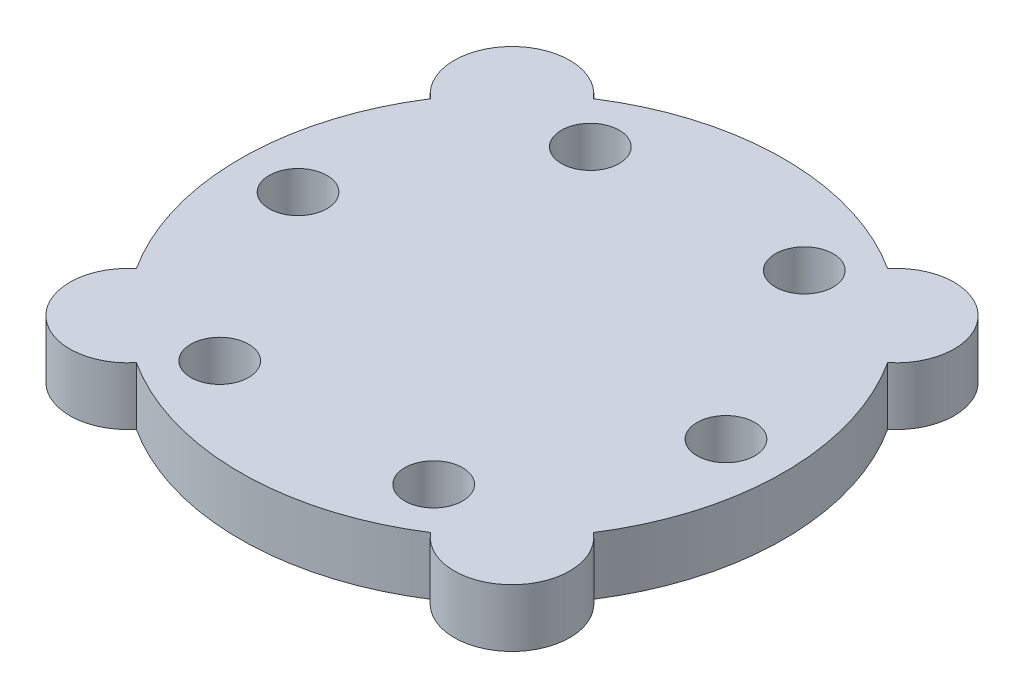
ISO-10303-21;
HEADER;
FILE_DESCRIPTION(('STEP AP214'),'2;1');
FILE_NAME('part.step','',(''),(''),'','','');
FILE_SCHEMA(('AUTOMOTIVE_DESIGN { 1 0 10303 214 1 1 1 1 }'));
ENDSEC;
DATA;
#1=APPLICATION_CONTEXT('core data for automotive mechanical design processes');
#2=APPLICATION_PROTOCOL_DEFINITION('international standard','automotive_design',2000,#1);
#3=PRODUCT_CONTEXT('',#1,'mechanical');
#4=PRODUCT('Part','Part','',(#3));
#5=PRODUCT_RELATED_PRODUCT_CATEGORY('part','',(#4));
#6=PRODUCT_DEFINITION_FORMATION('','',#4);
#7=PRODUCT_DEFINITION_CONTEXT('part definition',#1,'design');
#8=PRODUCT_DEFINITION('design','',#6,#7);
#9=PRODUCT_DEFINITION_SHAPE('','',#8);
#10=(LENGTH_UNIT() NAMED_UNIT(*) SI_UNIT(.MILLI.,.METRE.));
#11=(NAMED_UNIT(*) PLANE_ANGLE_UNIT() SI_UNIT($,.RADIAN.));
#12=(NAMED_UNIT(*) SI_UNIT($,.STERADIAN.) SOLID_ANGLE_UNIT());
#13=UNCERTAINTY_MEASURE_WITH_UNIT(LENGTH_MEASURE(1.E-05),#10,'distance_accuracy_value','');
#14=(GEOMETRIC_REPRESENTATION_CONTEXT(3) GLOBAL_UNCERTAINTY_ASSIGNED_CONTEXT((#13)) GLOBAL_UNIT_ASSIGNED_CONTEXT((#10,
#11,#12)) REPRESENTATION_CONTEXT('',''));
#15=CARTESIAN_POINT('',(0.,0.,0.));
#16=DIRECTION('',(0.,0.,1.));
#17=DIRECTION('',(1.,0.,0.));
#18=AXIS2_PLACEMENT_3D('',#15,#16,#17);
#19=CARTESIAN_POINT('',(0.,0.25,0.));
#20=DIRECTION('',(0.,-1.,0.));
#21=DIRECTION('',(0.,0.,-1.));
#22=AXIS2_PLACEMENT_3D('',#19,#20,#21);
#23=CYLINDRICAL_SURFACE('',#22,2.35);
#24=CARTESIAN_POINT('',(0.,-0.25,0.));
#25=DIRECTION('',(0.,1.,0.));
#26=DIRECTION('',(0.,0.,1.));
#27=AXIS2_PLACEMENT_3D('',#24,#25,#26);
#28=CIRCLE('',#27,2.35);
#29=CARTESIAN_POINT('',(-1.27254181674957,-0.25,1.97563592916906));
#30=VERTEX_POINT('',#29);
#31=CARTESIAN_POINT('',(1.27254181674956,-0.25,1.97563592916907));
#32=VERTEX_POINT('',#31);
#33=EDGE_CURVE('E132',#30,#32,#28,.T.);
#34=ORIENTED_EDGE('',*,*,#33,.T.);
#35=DIRECTION('',(0.,-1.,0.));
#36=VECTOR('',#35,1.);
#37=CARTESIAN_POINT('',(1.27254181674956,0.25,1.97563592916907));
#38=LINE('',#37,#36);
#39=CARTESIAN_POINT('',(1.27254181674956,0.25,1.97563592916907));
#40=VERTEX_POINT('',#39);
#41=EDGE_CURVE('E11',#40,#32,#38,.T.);
#42=ORIENTED_EDGE('',*,*,#41,.F.);
#43=CARTESIAN_POINT('',(0.,0.25,0.));
#44=DIRECTION('',(0.,1.,0.));
#45=DIRECTION('',(0.,0.,1.));
#46=AXIS2_PLACEMENT_3D('',#43,#44,#45);
#47=CIRCLE('',#46,2.35);
#48=CARTESIAN_POINT('',(-1.27254181674957,0.25,1.97563592916906));
#49=VERTEX_POINT('',#48);
#50=EDGE_CURVE('E147',#49,#40,#47,.T.);
#51=ORIENTED_EDGE('',*,*,#50,.F.);
#52=DIRECTION('',(0.,-1.,0.));
#53=VECTOR('',#52,1.);
#54=CARTESIAN_POINT('',(-1.27254181674957,0.25,1.97563592916906));
#55=LINE('',#54,#53);
#56=EDGE_CURVE('E128',#49,#30,#55,.T.);
#57=ORIENTED_EDGE('',*,*,#56,.T.);
#58=EDGE_LOOP('',(#34,#42,#51,#57));
#59=FACE_BOUND('',#58,.T.);
#60=ADVANCED_FACE('F36',(#59),#23,.T.);
#61=CARTESIAN_POINT('',(1.66170093578838,0.25,1.66170093578839));
#62=DIRECTION('',(0.,-1.,0.));
#63=DIRECTION('',(0.,0.,-1.));
#64=AXIS2_PLACEMENT_3D('',#61,#62,#63);
#65=CYLINDRICAL_SURFACE('',#64,0.5);
#66=CARTESIAN_POINT('',(1.66170093578838,-0.25,1.66170093578839));
#67=DIRECTION('',(0.,1.,0.));
#68=DIRECTION('',(0.,0.,1.));
#69=AXIS2_PLACEMENT_3D('',#66,#67,#68);
#70=CIRCLE('',#69,0.5);
#71=CARTESIAN_POINT('',(1.97563592916906,-0.25,1.27254181674957));
#72=VERTEX_POINT('',#71);
#73=EDGE_CURVE('E135',#32,#72,#70,.T.);
#74=ORIENTED_EDGE('',*,*,#73,.T.);
#75=DIRECTION('',(0.,-1.,0.));
#76=VECTOR('',#75,1.);
#77=CARTESIAN_POINT('',(1.97563592916906,0.25,1.27254181674957));
#78=LINE('',#77,#76);
#79=CARTESIAN_POINT('',(1.97563592916906,0.25,1.27254181674957));
#80=VERTEX_POINT('',#79);
#81=EDGE_CURVE('E44',#80,#72,#78,.T.);
#82=ORIENTED_EDGE('',*,*,#81,.F.);
#83=CARTESIAN_POINT('',(1.66170093578838,0.25,1.66170093578839));
#84=DIRECTION('',(0.,1.,0.));
#85=DIRECTION('',(0.,0.,1.));
#86=AXIS2_PLACEMENT_3D('',#83,#84,#85);
#87=CIRCLE('',#86,0.5);
#88=EDGE_CURVE('E95',#40,#80,#87,.T.);
#89=ORIENTED_EDGE('',*,*,#88,.F.);
#90=ORIENTED_EDGE('',*,*,#41,.T.);
#91=EDGE_LOOP('',(#74,#82,#89,#90));
#92=FACE_BOUND('',#91,.T.);
#93=ADVANCED_FACE('F249',(#92),#65,.T.);
#94=CARTESIAN_POINT('',(0.,0.25,0.));
#95=DIRECTION('',(0.,-1.,0.));
#96=DIRECTION('',(0.,0.,-1.));
#97=AXIS2_PLACEMENT_3D('',#94,#95,#96);
#98=CYLINDRICAL_SURFACE('',#97,2.35);
#99=CARTESIAN_POINT('',(0.,-0.25,0.));
#100=DIRECTION('',(0.,1.,0.));
#101=DIRECTION('',(0.,0.,1.));
#102=AXIS2_PLACEMENT_3D('',#99,#100,#101);
#103=CIRCLE('',#102,2.35);
#104=CARTESIAN_POINT('',(1.97563592916907,-0.25,-1.27254181674956));
#105=VERTEX_POINT('',#104);
#106=EDGE_CURVE('E138',#72,#105,#103,.T.);
#107=ORIENTED_EDGE('',*,*,#106,.T.);
#108=DIRECTION('',(0.,-1.,0.));
#109=VECTOR('',#108,1.);
#110=CARTESIAN_POINT('',(1.97563592916907,0.25,-1.27254181674956));
#111=LINE('',#110,#109);
#112=CARTESIAN_POINT('',(1.97563592916907,0.25,-1.27254181674956));
#113=VERTEX_POINT('',#112);
#114=EDGE_CURVE('E154',#113,#105,#111,.T.);
#115=ORIENTED_EDGE('',*,*,#114,.F.);
#116=CARTESIAN_POINT('',(0.,0.25,0.));
#117=DIRECTION('',(0.,1.,0.));
#118=DIRECTION('',(0.,0.,1.));
#119=AXIS2_PLACEMENT_3D('',#116,#117,#118);
#120=CIRCLE('',#119,2.35);
#121=EDGE_CURVE('E162',#80,#113,#120,.T.);
#122=ORIENTED_EDGE('',*,*,#121,.F.);
#123=ORIENTED_EDGE('',*,*,#81,.T.);
#124=EDGE_LOOP('',(#107,#115,#122,#123));
#125=FACE_BOUND('',#124,.T.);
#126=ADVANCED_FACE('F160',(#125),#98,.T.);
#127=CARTESIAN_POINT('',(1.66170093578839,0.25,-1.66170093578838));
#128=DIRECTION('',(0.,-1.,0.));
#129=DIRECTION('',(0.,0.,-1.));
#130=AXIS2_PLACEMENT_3D('',#127,#128,#129);
#131=CYLINDRICAL_SURFACE('',#130,0.500000000000001);
#132=CARTESIAN_POINT('',(1.66170093578839,-0.25,-1.66170093578838));
#133=DIRECTION('',(0.,1.,0.));
#134=DIRECTION('',(0.,0.,1.));
#135=AXIS2_PLACEMENT_3D('',#132,#133,#134);
#136=CIRCLE('',#135,0.500000000000001);
#137=CARTESIAN_POINT('',(1.27254181674957,-0.25,-1.97563592916906));
#138=VERTEX_POINT('',#137);
#139=EDGE_CURVE('E140',#105,#138,#136,.T.);
#140=ORIENTED_EDGE('',*,*,#139,.T.);
#141=DIRECTION('',(0.,-1.,0.));
#142=VECTOR('',#141,1.);
#143=CARTESIAN_POINT('',(1.27254181674957,0.25,-1.97563592916906));
#144=LINE('',#143,#142);
#145=CARTESIAN_POINT('',(1.27254181674957,0.25,-1.97563592916906));
#146=VERTEX_POINT('',#145);
#147=EDGE_CURVE('E151',#146,#138,#144,.T.);
#148=ORIENTED_EDGE('',*,*,#147,.F.);
#149=CARTESIAN_POINT('',(1.66170093578839,0.25,-1.66170093578838));
#150=DIRECTION('',(0.,1.,0.));
#151=DIRECTION('',(0.,0.,1.));
#152=AXIS2_PLACEMENT_3D('',#149,#150,#151);
#153=CIRCLE('',#152,0.500000000000001);
#154=EDGE_CURVE('E174',#113,#146,#153,.T.);
#155=ORIENTED_EDGE('',*,*,#154,.F.);
#156=ORIENTED_EDGE('',*,*,#114,.T.);
#157=EDGE_LOOP('',(#140,#148,#155,#156));
#158=FACE_BOUND('',#157,.T.);
#159=ADVANCED_FACE('F170',(#158),#131,.T.);
#160=CARTESIAN_POINT('',(0.,0.25,0.));
#161=DIRECTION('',(0.,-1.,0.));
#162=DIRECTION('',(0.,0.,-1.));
#163=AXIS2_PLACEMENT_3D('',#160,#161,#162);
#164=CYLINDRICAL_SURFACE('',#163,2.35);
#165=CARTESIAN_POINT('',(0.,-0.25,0.));
#166=DIRECTION('',(0.,1.,0.));
#167=DIRECTION('',(0.,0.,1.));
#168=AXIS2_PLACEMENT_3D('',#165,#166,#167);
#169=CIRCLE('',#168,2.35);
#170=CARTESIAN_POINT('',(-1.27254181674956,-0.25,-1.97563592916907));
#171=VERTEX_POINT('',#170);
#172=EDGE_CURVE('E142',#138,#171,#169,.T.);
#173=ORIENTED_EDGE('',*,*,#172,.T.);
#174=DIRECTION('',(0.,-1.,0.));
#175=VECTOR('',#174,1.);
#176=CARTESIAN_POINT('',(-1.27254181674956,0.25,-1.97563592916907));
#177=LINE('',#176,#175);
#178=CARTESIAN_POINT('',(-1.27254181674956,0.25,-1.97563592916907));
#179=VERTEX_POINT('',#178);
#180=EDGE_CURVE('E123',#179,#171,#177,.T.);
#181=ORIENTED_EDGE('',*,*,#180,.F.);
#182=CARTESIAN_POINT('',(0.,0.25,0.));
#183=DIRECTION('',(0.,1.,0.));
#184=DIRECTION('',(0.,0.,1.));
#185=AXIS2_PLACEMENT_3D('',#182,#183,#184);
#186=CIRCLE('',#185,2.35);
#187=EDGE_CURVE('E114',#146,#179,#186,.T.);
#188=ORIENTED_EDGE('',*,*,#187,.F.);
#189=ORIENTED_EDGE('',*,*,#147,.T.);
#190=EDGE_LOOP('',(#173,#181,#188,#189));
#191=FACE_BOUND('',#190,.T.);
#192=ADVANCED_FACE('F173',(#191),#164,.T.);
#193=CARTESIAN_POINT('',(-1.66170093578838,0.25,-1.66170093578839));
#194=DIRECTION('',(0.,-1.,0.));
#195=DIRECTION('',(0.,0.,-1.));
#196=AXIS2_PLACEMENT_3D('',#193,#194,#195);
#197=CYLINDRICAL_SURFACE('',#196,0.5);
#198=CARTESIAN_POINT('',(-1.66170093578838,-0.25,-1.66170093578839));
#199=DIRECTION('',(0.,1.,0.));
#200=DIRECTION('',(0.,0.,1.));
#201=AXIS2_PLACEMENT_3D('',#198,#199,#200);
#202=CIRCLE('',#201,0.5);
#203=CARTESIAN_POINT('',(-1.97563592916906,-0.25,-1.27254181674957));
#204=VERTEX_POINT('',#203);
#205=EDGE_CURVE('E122',#171,#204,#202,.T.);
#206=ORIENTED_EDGE('',*,*,#205,.T.);
#207=DIRECTION('',(0.,-1.,0.));
#208=VECTOR('',#207,1.);
#209=CARTESIAN_POINT('',(-1.97563592916906,0.25,-1.27254181674957));
#210=LINE('',#209,#208);
#211=CARTESIAN_POINT('',(-1.97563592916906,0.25,-1.27254181674957));
#212=VERTEX_POINT('',#211);
#213=EDGE_CURVE('E119',#212,#204,#210,.T.);
#214=ORIENTED_EDGE('',*,*,#213,.F.);
#215=CARTESIAN_POINT('',(-1.66170093578838,0.25,-1.66170093578839));
#216=DIRECTION('',(0.,1.,0.));
#217=DIRECTION('',(0.,0.,1.));
#218=AXIS2_PLACEMENT_3D('',#215,#216,#217);
#219=CIRCLE('',#218,0.5);
#220=EDGE_CURVE('E108',#179,#212,#219,.T.);
#221=ORIENTED_EDGE('',*,*,#220,.F.);
#222=ORIENTED_EDGE('',*,*,#180,.T.);
#223=EDGE_LOOP('',(#206,#214,#221,#222));
#224=FACE_BOUND('',#223,.T.);
#225=ADVANCED_FACE('F120',(#224),#197,.T.);
#226=CARTESIAN_POINT('',(0.,0.25,0.));
#227=DIRECTION('',(0.,-1.,0.));
#228=DIRECTION('',(0.,0.,-1.));
#229=AXIS2_PLACEMENT_3D('',#226,#227,#228);
#230=CYLINDRICAL_SURFACE('',#229,2.35);
#231=CARTESIAN_POINT('',(0.,-0.25,0.));
#232=DIRECTION('',(0.,1.,0.));
#233=DIRECTION('',(0.,0.,1.));
#234=AXIS2_PLACEMENT_3D('',#231,#232,#233);
#235=CIRCLE('',#234,2.35);
#236=CARTESIAN_POINT('',(-1.97563592916907,-0.25,1.27254181674956));
#237=VERTEX_POINT('',#236);
#238=EDGE_CURVE('E81',#204,#237,#235,.T.);
#239=ORIENTED_EDGE('',*,*,#238,.T.);
#240=DIRECTION('',(0.,-1.,0.));
#241=VECTOR('',#240,1.);
#242=CARTESIAN_POINT('',(-1.97563592916907,0.25,1.27254181674956));
#243=LINE('',#242,#241);
#244=CARTESIAN_POINT('',(-1.97563592916907,0.25,1.27254181674956));
#245=VERTEX_POINT('',#244);
#246=EDGE_CURVE('E124',#245,#237,#243,.T.);
#247=ORIENTED_EDGE('',*,*,#246,.F.);
#248=CARTESIAN_POINT('',(0.,0.25,0.));
#249=DIRECTION('',(0.,1.,0.));
#250=DIRECTION('',(0.,0.,1.));
#251=AXIS2_PLACEMENT_3D('',#248,#249,#250);
#252=CIRCLE('',#251,2.35);
#253=EDGE_CURVE('E112',#212,#245,#252,.T.);
#254=ORIENTED_EDGE('',*,*,#253,.F.);
#255=ORIENTED_EDGE('',*,*,#213,.T.);
#256=EDGE_LOOP('',(#239,#247,#254,#255));
#257=FACE_BOUND('',#256,.T.);
#258=ADVANCED_FACE('F126',(#257),#230,.T.);
#259=CARTESIAN_POINT('',(-1.66170093578839,0.25,1.66170093578838));
#260=DIRECTION('',(0.,-1.,0.));
#261=DIRECTION('',(0.,0.,-1.));
#262=AXIS2_PLACEMENT_3D('',#259,#260,#261);
#263=CYLINDRICAL_SURFACE('',#262,0.500000000000001);
#264=CARTESIAN_POINT('',(-1.66170093578839,-0.25,1.66170093578838));
#265=DIRECTION('',(0.,1.,0.));
#266=DIRECTION('',(0.,0.,1.));
#267=AXIS2_PLACEMENT_3D('',#264,#265,#266);
#268=CIRCLE('',#267,0.500000000000001);
#269=EDGE_CURVE('E87',#237,#30,#268,.T.);
#270=ORIENTED_EDGE('',*,*,#269,.T.);
#271=ORIENTED_EDGE('',*,*,#56,.F.);
#272=CARTESIAN_POINT('',(-1.66170093578839,0.25,1.66170093578838));
#273=DIRECTION('',(0.,1.,0.));
#274=DIRECTION('',(0.,0.,1.));
#275=AXIS2_PLACEMENT_3D('',#272,#273,#274);
#276=CIRCLE('',#275,0.500000000000001);
#277=EDGE_CURVE('E52',#245,#49,#276,.T.);
#278=ORIENTED_EDGE('',*,*,#277,.F.);
#279=ORIENTED_EDGE('',*,*,#246,.T.);
#280=EDGE_LOOP('',(#270,#271,#278,#279));
#281=FACE_BOUND('',#280,.T.);
#282=ADVANCED_FACE('F221',(#281),#263,.T.);
#283=CARTESIAN_POINT('',(0.830850467894192,0.25,0.830850467894194));
#284=DIRECTION('',(0.,1.,0.));
#285=DIRECTION('',(0.,0.,1.));
#286=AXIS2_PLACEMENT_3D('',#283,#284,#285);
#287=PLANE('',#286);
#288=CARTESIAN_POINT('',(-0.925000000000019,0.25,1.6021469970012));
#289=DIRECTION('',(0.,1.,0.));
#290=DIRECTION('',(0.,0.,1.));
#291=AXIS2_PLACEMENT_3D('',#288,#289,#290);
#292=CIRCLE('',#291,0.25);
#293=CARTESIAN_POINT('',(-0.925000000000019,0.25,1.8521469970012));
#294=VERTEX_POINT('',#293);
#295=EDGE_CURVE('E212',#294,#294,#292,.T.);
#296=ORIENTED_EDGE('',*,*,#295,.F.);
#297=EDGE_LOOP('',(#296));
#298=FACE_BOUND('',#297,.T.);
#299=CARTESIAN_POINT('',(0.924999999999985,0.25,1.60214699700122));
#300=DIRECTION('',(0.,1.,0.));
#301=DIRECTION('',(0.,0.,1.));
#302=AXIS2_PLACEMENT_3D('',#299,#300,#301);
#303=CIRCLE('',#302,0.250000000000001);
#304=CARTESIAN_POINT('',(0.924999999999985,0.25,1.85214699700122));
#305=VERTEX_POINT('',#304);
#306=EDGE_CURVE('E206',#305,#305,#303,.T.);
#307=ORIENTED_EDGE('',*,*,#306,.F.);
#308=EDGE_LOOP('',(#307));
#309=FACE_BOUND('',#308,.T.);
#310=CARTESIAN_POINT('',(1.85,0.25,0.));
#311=DIRECTION('',(0.,1.,0.));
#312=DIRECTION('',(0.,0.,1.));
#313=AXIS2_PLACEMENT_3D('',#310,#311,#312);
#314=CIRCLE('',#313,0.250000000000005);
#315=CARTESIAN_POINT('',(1.85,0.25,0.250000000000004));
#316=VERTEX_POINT('',#315);
#317=EDGE_CURVE('E200',#316,#316,#314,.T.);
#318=ORIENTED_EDGE('',*,*,#317,.F.);
#319=EDGE_LOOP('',(#318));
#320=FACE_BOUND('',#319,.T.);
#321=CARTESIAN_POINT('',(0.925000000000008,0.25,-1.60214699700121));
#322=DIRECTION('',(0.,1.,0.));
#323=DIRECTION('',(0.,0.,1.));
#324=AXIS2_PLACEMENT_3D('',#321,#322,#323);
#325=CIRCLE('',#324,0.25);
#326=CARTESIAN_POINT('',(0.925000000000008,0.25,-1.35214699700121));
#327=VERTEX_POINT('',#326);
#328=EDGE_CURVE('E194',#327,#327,#325,.T.);
#329=ORIENTED_EDGE('',*,*,#328,.F.);
#330=EDGE_LOOP('',(#329));
#331=FACE_BOUND('',#330,.T.);
#332=CARTESIAN_POINT('',(-0.924999999999996,0.25,-1.60214699700121));
#333=DIRECTION('',(0.,1.,0.));
#334=DIRECTION('',(0.,0.,1.));
#335=AXIS2_PLACEMENT_3D('',#332,#333,#334);
#336=CIRCLE('',#335,0.25);
#337=CARTESIAN_POINT('',(-0.924999999999996,0.25,-1.35214699700121));
#338=VERTEX_POINT('',#337);
#339=EDGE_CURVE('E188',#338,#338,#336,.T.);
#340=ORIENTED_EDGE('',*,*,#339,.F.);
#341=EDGE_LOOP('',(#340));
#342=FACE_BOUND('',#341,.T.);
#343=CARTESIAN_POINT('',(-1.85,0.25,0.));
#344=DIRECTION('',(0.,1.,0.));
#345=DIRECTION('',(0.,0.,1.));
#346=AXIS2_PLACEMENT_3D('',#343,#344,#345);
#347=CIRCLE('',#346,0.250000000000001);
#348=CARTESIAN_POINT('',(-1.85,0.25,0.250000000000001));
#349=VERTEX_POINT('',#348);
#350=EDGE_CURVE('E182',#349,#349,#347,.T.);
#351=ORIENTED_EDGE('',*,*,#350,.F.);
#352=EDGE_LOOP('',(#351));
#353=FACE_BOUND('',#352,.T.);
#354=ORIENTED_EDGE('',*,*,#50,.T.);
#355=ORIENTED_EDGE('',*,*,#88,.T.);
#356=ORIENTED_EDGE('',*,*,#121,.T.);
#357=ORIENTED_EDGE('',*,*,#154,.T.);
#358=ORIENTED_EDGE('',*,*,#187,.T.);
#359=ORIENTED_EDGE('',*,*,#220,.T.);
#360=ORIENTED_EDGE('',*,*,#253,.T.);
#361=ORIENTED_EDGE('',*,*,#277,.T.);
#362=EDGE_LOOP('',(#354,#355,#356,#357,#358,#359,#360,#361));
#363=FACE_BOUND('',#362,.T.);
#364=ADVANCED_FACE('F110',(#298,#309,#320,#331,#342,#353,#363),#287,.T.);
#365=CARTESIAN_POINT('',(0.830850467894192,-0.25,0.830850467894194));
#366=DIRECTION('',(0.,1.,0.));
#367=DIRECTION('',(0.,0.,1.));
#368=AXIS2_PLACEMENT_3D('',#365,#366,#367);
#369=PLANE('',#368);
#370=CARTESIAN_POINT('',(-0.925000000000019,-0.25,1.6021469970012));
#371=DIRECTION('',(0.,1.,0.));
#372=DIRECTION('',(0.,0.,1.));
#373=AXIS2_PLACEMENT_3D('',#370,#371,#372);
#374=CIRCLE('',#373,0.25);
#375=CARTESIAN_POINT('',(-0.925000000000019,-0.25,1.8521469970012));
#376=VERTEX_POINT('',#375);
#377=EDGE_CURVE('E209',#376,#376,#374,.F.);
#378=ORIENTED_EDGE('',*,*,#377,.F.);
#379=EDGE_LOOP('',(#378));
#380=FACE_BOUND('',#379,.T.);
#381=CARTESIAN_POINT('',(0.924999999999985,-0.25,1.60214699700122));
#382=DIRECTION('',(0.,1.,0.));
#383=DIRECTION('',(0.,0.,1.));
#384=AXIS2_PLACEMENT_3D('',#381,#382,#383);
#385=CIRCLE('',#384,0.250000000000001);
#386=CARTESIAN_POINT('',(0.924999999999985,-0.25,1.85214699700122));
#387=VERTEX_POINT('',#386);
#388=EDGE_CURVE('E203',#387,#387,#385,.F.);
#389=ORIENTED_EDGE('',*,*,#388,.F.);
#390=EDGE_LOOP('',(#389));
#391=FACE_BOUND('',#390,.T.);
#392=CARTESIAN_POINT('',(1.85,-0.25,0.));
#393=DIRECTION('',(0.,1.,0.));
#394=DIRECTION('',(0.,0.,1.));
#395=AXIS2_PLACEMENT_3D('',#392,#393,#394);
#396=CIRCLE('',#395,0.250000000000005);
#397=CARTESIAN_POINT('',(1.85,-0.25,0.250000000000004));
#398=VERTEX_POINT('',#397);
#399=EDGE_CURVE('E197',#398,#398,#396,.F.);
#400=ORIENTED_EDGE('',*,*,#399,.F.);
#401=EDGE_LOOP('',(#400));
#402=FACE_BOUND('',#401,.T.);
#403=CARTESIAN_POINT('',(0.925000000000008,-0.25,-1.60214699700121));
#404=DIRECTION('',(0.,1.,0.));
#405=DIRECTION('',(0.,0.,1.));
#406=AXIS2_PLACEMENT_3D('',#403,#404,#405);
#407=CIRCLE('',#406,0.25);
#408=CARTESIAN_POINT('',(0.925000000000008,-0.25,-1.35214699700121));
#409=VERTEX_POINT('',#408);
#410=EDGE_CURVE('E191',#409,#409,#407,.F.);
#411=ORIENTED_EDGE('',*,*,#410,.F.);
#412=EDGE_LOOP('',(#411));
#413=FACE_BOUND('',#412,.T.);
#414=CARTESIAN_POINT('',(-0.924999999999996,-0.25,-1.60214699700121));
#415=DIRECTION('',(0.,1.,0.));
#416=DIRECTION('',(0.,0.,1.));
#417=AXIS2_PLACEMENT_3D('',#414,#415,#416);
#418=CIRCLE('',#417,0.25);
#419=CARTESIAN_POINT('',(-0.924999999999996,-0.25,-1.35214699700121));
#420=VERTEX_POINT('',#419);
#421=EDGE_CURVE('E185',#420,#420,#418,.F.);
#422=ORIENTED_EDGE('',*,*,#421,.F.);
#423=EDGE_LOOP('',(#422));
#424=FACE_BOUND('',#423,.T.);
#425=CARTESIAN_POINT('',(-1.85,-0.25,0.));
#426=DIRECTION('',(0.,1.,0.));
#427=DIRECTION('',(0.,0.,1.));
#428=AXIS2_PLACEMENT_3D('',#425,#426,#427);
#429=CIRCLE('',#428,0.250000000000001);
#430=CARTESIAN_POINT('',(-1.85,-0.25,0.250000000000001));
#431=VERTEX_POINT('',#430);
#432=EDGE_CURVE('E136',#431,#431,#429,.F.);
#433=ORIENTED_EDGE('',*,*,#432,.F.);
#434=EDGE_LOOP('',(#433));
#435=FACE_BOUND('',#434,.T.);
#436=ORIENTED_EDGE('',*,*,#33,.F.);
#437=ORIENTED_EDGE('',*,*,#269,.F.);
#438=ORIENTED_EDGE('',*,*,#238,.F.);
#439=ORIENTED_EDGE('',*,*,#205,.F.);
#440=ORIENTED_EDGE('',*,*,#172,.F.);
#441=ORIENTED_EDGE('',*,*,#139,.F.);
#442=ORIENTED_EDGE('',*,*,#106,.F.);
#443=ORIENTED_EDGE('',*,*,#73,.F.);
#444=EDGE_LOOP('',(#436,#437,#438,#439,#440,#441,#442,#443));
#445=FACE_BOUND('',#444,.T.);
#446=ADVANCED_FACE('F166',(#380,#391,#402,#413,#424,#435,#445),#369,.F.);
#447=CARTESIAN_POINT('',(-1.85,-0.251,0.));
#448=DIRECTION('',(0.,1.,0.));
#449=DIRECTION('',(0.,0.,1.));
#450=AXIS2_PLACEMENT_3D('',#447,#448,#449);
#451=CYLINDRICAL_SURFACE('',#450,0.250000000000001);
#452=ORIENTED_EDGE('',*,*,#350,.T.);
#453=EDGE_LOOP('',(#452));
#454=FACE_BOUND('',#453,.T.);
#455=ORIENTED_EDGE('',*,*,#432,.T.);
#456=EDGE_LOOP('',(#455));
#457=FACE_BOUND('',#456,.T.);
#458=ADVANCED_FACE('F233',(#454,#457),#451,.F.);
#459=CARTESIAN_POINT('',(-0.924999999999996,-0.251,-1.60214699700121));
#460=DIRECTION('',(0.,1.,0.));
#461=DIRECTION('',(0.,0.,1.));
#462=AXIS2_PLACEMENT_3D('',#459,#460,#461);
#463=CYLINDRICAL_SURFACE('',#462,0.25);
#464=ORIENTED_EDGE('',*,*,#339,.T.);
#465=EDGE_LOOP('',(#464));
#466=FACE_BOUND('',#465,.T.);
#467=ORIENTED_EDGE('',*,*,#421,.T.);
#468=EDGE_LOOP('',(#467));
#469=FACE_BOUND('',#468,.T.);
#470=ADVANCED_FACE('F236',(#466,#469),#463,.F.);
#471=CARTESIAN_POINT('',(0.925000000000008,-0.251,-1.60214699700121));
#472=DIRECTION('',(0.,1.,0.));
#473=DIRECTION('',(0.,0.,1.));
#474=AXIS2_PLACEMENT_3D('',#471,#472,#473);
#475=CYLINDRICAL_SURFACE('',#474,0.25);
#476=ORIENTED_EDGE('',*,*,#328,.T.);
#477=EDGE_LOOP('',(#476));
#478=FACE_BOUND('',#477,.T.);
#479=ORIENTED_EDGE('',*,*,#410,.T.);
#480=EDGE_LOOP('',(#479));
#481=FACE_BOUND('',#480,.T.);
#482=ADVANCED_FACE('F318',(#478,#481),#475,.F.);
#483=CARTESIAN_POINT('',(1.85,-0.251,0.));
#484=DIRECTION('',(0.,1.,0.));
#485=DIRECTION('',(0.,0.,1.));
#486=AXIS2_PLACEMENT_3D('',#483,#484,#485);
#487=CYLINDRICAL_SURFACE('',#486,0.250000000000005);
#488=ORIENTED_EDGE('',*,*,#317,.T.);
#489=EDGE_LOOP('',(#488));
#490=FACE_BOUND('',#489,.T.);
#491=ORIENTED_EDGE('',*,*,#399,.T.);
#492=EDGE_LOOP('',(#491));
#493=FACE_BOUND('',#492,.T.);
#494=ADVANCED_FACE('F328',(#490,#493),#487,.F.);
#495=CARTESIAN_POINT('',(0.924999999999985,-0.251,1.60214699700122));
#496=DIRECTION('',(0.,1.,0.));
#497=DIRECTION('',(0.,0.,1.));
#498=AXIS2_PLACEMENT_3D('',#495,#496,#497);
#499=CYLINDRICAL_SURFACE('',#498,0.250000000000001);
#500=ORIENTED_EDGE('',*,*,#306,.T.);
#501=EDGE_LOOP('',(#500));
#502=FACE_BOUND('',#501,.T.);
#503=ORIENTED_EDGE('',*,*,#388,.T.);
#504=EDGE_LOOP('',(#503));
#505=FACE_BOUND('',#504,.T.);
#506=ADVANCED_FACE('F338',(#502,#505),#499,.F.);
#507=CARTESIAN_POINT('',(-0.925000000000019,-0.251,1.6021469970012));
#508=DIRECTION('',(0.,1.,0.));
#509=DIRECTION('',(0.,0.,1.));
#510=AXIS2_PLACEMENT_3D('',#507,#508,#509);
#511=CYLINDRICAL_SURFACE('',#510,0.25);
#512=ORIENTED_EDGE('',*,*,#295,.T.);
#513=EDGE_LOOP('',(#512));
#514=FACE_BOUND('',#513,.T.);
#515=ORIENTED_EDGE('',*,*,#377,.T.);
#516=EDGE_LOOP('',(#515));
#517=FACE_BOUND('',#516,.T.);
#518=ADVANCED_FACE('F216',(#514,#517),#511,.F.);
#519=CLOSED_SHELL('',(#60,#93,#126,#159,#192,#225,#258,#282,#364,#446,#458,#470,#482,#494,#506,#518));
#520=MANIFOLD_SOLID_BREP('B2',#519);
#521=ADVANCED_BREP_SHAPE_REPRESENTATION('',(#18,#520),#14);
#522=SHAPE_DEFINITION_REPRESENTATION(#9,#521);
ENDSEC;
END-ISO-10303-21;
